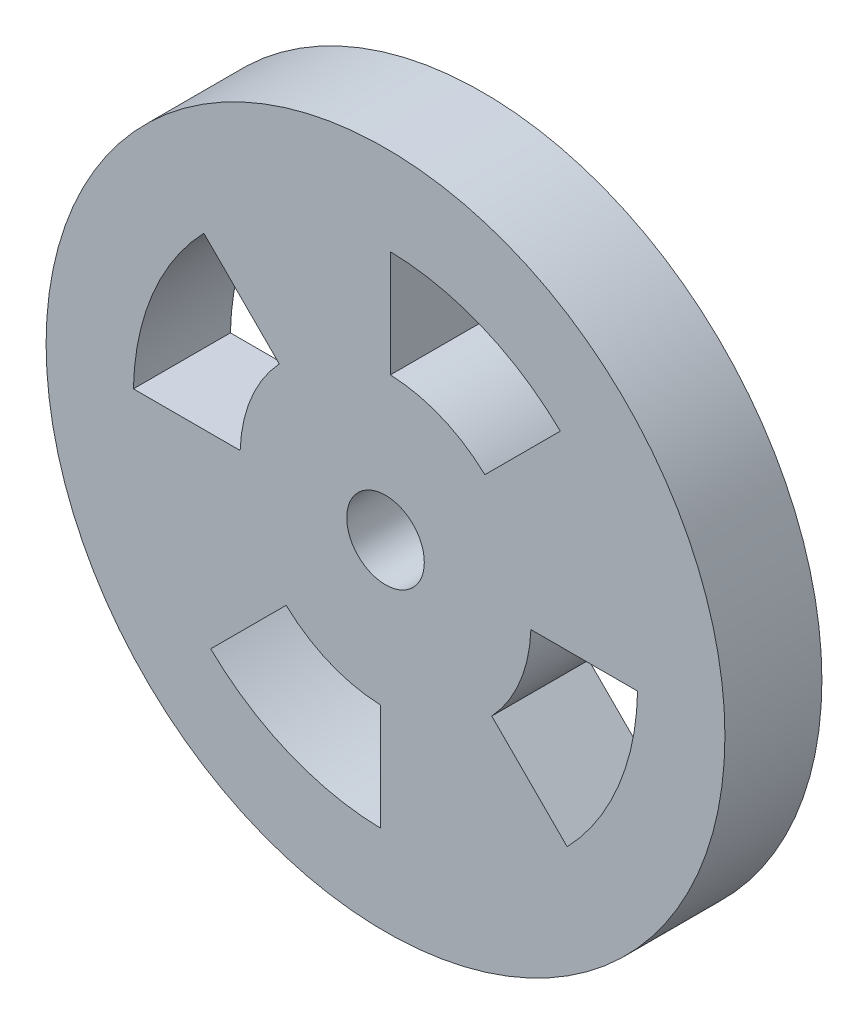
ISO-10303-21;
HEADER;
FILE_DESCRIPTION(('STEP AP214'),'2;1');
FILE_NAME('part.step','',(''),(''),'','','');
FILE_SCHEMA(('AUTOMOTIVE_DESIGN { 1 0 10303 214 1 1 1 1 }'));
ENDSEC;
DATA;
#1=APPLICATION_CONTEXT('core data for automotive mechanical design processes');
#2=APPLICATION_PROTOCOL_DEFINITION('international standard','automotive_design',2000,#1);
#3=PRODUCT_CONTEXT('',#1,'mechanical');
#4=PRODUCT('Part','Part','',(#3));
#5=PRODUCT_RELATED_PRODUCT_CATEGORY('part','',(#4));
#6=PRODUCT_DEFINITION_FORMATION('','',#4);
#7=PRODUCT_DEFINITION_CONTEXT('part definition',#1,'design');
#8=PRODUCT_DEFINITION('design','',#6,#7);
#9=PRODUCT_DEFINITION_SHAPE('','',#8);
#10=(LENGTH_UNIT() NAMED_UNIT(*) SI_UNIT(.MILLI.,.METRE.));
#11=(NAMED_UNIT(*) PLANE_ANGLE_UNIT() SI_UNIT($,.RADIAN.));
#12=(NAMED_UNIT(*) SI_UNIT($,.STERADIAN.) SOLID_ANGLE_UNIT());
#13=UNCERTAINTY_MEASURE_WITH_UNIT(LENGTH_MEASURE(1.E-05),#10,'distance_accuracy_value','');
#14=(GEOMETRIC_REPRESENTATION_CONTEXT(3) GLOBAL_UNCERTAINTY_ASSIGNED_CONTEXT((#13)) GLOBAL_UNIT_ASSIGNED_CONTEXT((#10,
#11,#12)) REPRESENTATION_CONTEXT('',''));
#15=CARTESIAN_POINT('',(0.,0.,0.));
#16=DIRECTION('',(0.,0.,1.));
#17=DIRECTION('',(1.,0.,0.));
#18=AXIS2_PLACEMENT_3D('',#15,#16,#17);
#19=CARTESIAN_POINT('',(0.,0.,1.));
#20=DIRECTION('',(0.,0.,1.));
#21=DIRECTION('',(1.,0.,0.));
#22=AXIS2_PLACEMENT_3D('',#19,#20,#21);
#23=PLANE('',#22);
#24=DIRECTION('',(-0.707106781186548,-0.707106781186548,0.));
#25=VECTOR('',#24,1.);
#26=CARTESIAN_POINT('',(-0.035355339160987,0.035355339160987,1.));
#27=LINE('',#26,#25);
#28=CARTESIAN_POINT('',(1.80278230530224,1.87349298362421,1.));
#29=VERTEX_POINT('',#28);
#30=CARTESIAN_POINT('',(1.02471541319133,1.09542609151331,1.));
#31=VERTEX_POINT('',#30);
#32=EDGE_CURVE('E184',#29,#31,#27,.T.);
#33=ORIENTED_EDGE('',*,*,#32,.T.);
#34=CARTESIAN_POINT('',(0.,0.,1.));
#35=DIRECTION('',(0.,0.,1.));
#36=DIRECTION('',(1.,0.,0.));
#37=AXIS2_PLACEMENT_3D('',#34,#35,#36);
#38=CIRCLE('',#37,1.5);
#39=CARTESIAN_POINT('',(0.0499999999999945,1.4991664350565,1.));
#40=VERTEX_POINT('',#39);
#41=EDGE_CURVE('E161',#31,#40,#38,.T.);
#42=ORIENTED_EDGE('',*,*,#41,.T.);
#43=DIRECTION('',(0.,-1.,0.));
#44=VECTOR('',#43,1.);
#45=CARTESIAN_POINT('',(0.0499999999999945,0.,1.));
#46=LINE('',#45,#44);
#47=CARTESIAN_POINT('',(0.0499999999999943,2.59951918631119,1.));
#48=VERTEX_POINT('',#47);
#49=EDGE_CURVE('E195',#48,#40,#46,.T.);
#50=ORIENTED_EDGE('',*,*,#49,.F.);
#51=CARTESIAN_POINT('',(0.,0.,1.));
#52=DIRECTION('',(0.,0.,1.));
#53=DIRECTION('',(1.,0.,0.));
#54=AXIS2_PLACEMENT_3D('',#51,#52,#53);
#55=CIRCLE('',#54,2.6);
#56=EDGE_CURVE('E198',#29,#48,#55,.T.);
#57=ORIENTED_EDGE('',*,*,#56,.F.);
#58=EDGE_LOOP('',(#33,#42,#50,#57));
#59=FACE_BOUND('',#58,.T.);
#60=DIRECTION('',(0.707106781186548,0.707106781186548,0.));
#61=VECTOR('',#60,1.);
#62=CARTESIAN_POINT('',(0.035355339160987,-0.035355339160987,1.));
#63=LINE('',#62,#61);
#64=CARTESIAN_POINT('',(-1.80278230530224,-1.87349298362421,1.));
#65=VERTEX_POINT('',#64);
#66=CARTESIAN_POINT('',(-1.02471541319133,-1.09542609151331,1.));
#67=VERTEX_POINT('',#66);
#68=EDGE_CURVE('E246',#65,#67,#63,.T.);
#69=ORIENTED_EDGE('',*,*,#68,.T.);
#70=CARTESIAN_POINT('',(0.,0.,1.));
#71=DIRECTION('',(0.,0.,1.));
#72=DIRECTION('',(1.,0.,0.));
#73=AXIS2_PLACEMENT_3D('',#70,#71,#72);
#74=CIRCLE('',#73,1.5);
#75=CARTESIAN_POINT('',(-0.0499999999999945,-1.4991664350565,1.));
#76=VERTEX_POINT('',#75);
#77=EDGE_CURVE('E242',#67,#76,#74,.T.);
#78=ORIENTED_EDGE('',*,*,#77,.T.);
#79=DIRECTION('',(0.,1.,0.));
#80=VECTOR('',#79,1.);
#81=CARTESIAN_POINT('',(-0.0499999999999945,0.,1.));
#82=LINE('',#81,#80);
#83=CARTESIAN_POINT('',(-0.0499999999999958,-2.59951918631119,1.));
#84=VERTEX_POINT('',#83);
#85=EDGE_CURVE('E257',#84,#76,#82,.T.);
#86=ORIENTED_EDGE('',*,*,#85,.F.);
#87=CARTESIAN_POINT('',(0.,0.,1.));
#88=DIRECTION('',(0.,0.,1.));
#89=DIRECTION('',(1.,0.,0.));
#90=AXIS2_PLACEMENT_3D('',#87,#88,#89);
#91=CIRCLE('',#90,2.6);
#92=EDGE_CURVE('E260',#65,#84,#91,.T.);
#93=ORIENTED_EDGE('',*,*,#92,.F.);
#94=EDGE_LOOP('',(#69,#78,#86,#93));
#95=FACE_BOUND('',#94,.T.);
#96=CARTESIAN_POINT('',(0.,0.,1.));
#97=DIRECTION('',(0.,0.,1.));
#98=DIRECTION('',(1.,0.,0.));
#99=AXIS2_PLACEMENT_3D('',#96,#97,#98);
#100=CIRCLE('',#99,0.4);
#101=CARTESIAN_POINT('',(0.4,0.,1.));
#102=VERTEX_POINT('',#101);
#103=EDGE_CURVE('E273',#102,#102,#100,.T.);
#104=ORIENTED_EDGE('',*,*,#103,.F.);
#105=EDGE_LOOP('',(#104));
#106=FACE_BOUND('',#105,.T.);
#107=CARTESIAN_POINT('',(0.,0.,1.));
#108=DIRECTION('',(0.,0.,1.));
#109=DIRECTION('',(1.,0.,0.));
#110=AXIS2_PLACEMENT_3D('',#107,#108,#109);
#111=CIRCLE('',#110,3.5);
#112=CARTESIAN_POINT('',(3.5,0.,1.));
#113=VERTEX_POINT('',#112);
#114=EDGE_CURVE('E11',#113,#113,#111,.T.);
#115=ORIENTED_EDGE('',*,*,#114,.T.);
#116=EDGE_LOOP('',(#115));
#117=FACE_BOUND('',#116,.T.);
#118=DIRECTION('',(-0.70710678118655,0.707106781186545,0.));
#119=VECTOR('',#118,1.);
#120=CARTESIAN_POINT('',(0.0353553391609868,0.0353553391609871,1.));
#121=LINE('',#120,#119);
#122=CARTESIAN_POINT('',(1.87349298362422,-1.80278230530223,1.));
#123=VERTEX_POINT('',#122);
#124=CARTESIAN_POINT('',(1.09542609151331,-1.02471541319133,1.));
#125=VERTEX_POINT('',#124);
#126=EDGE_CURVE('E215',#123,#125,#121,.T.);
#127=ORIENTED_EDGE('',*,*,#126,.T.);
#128=CARTESIAN_POINT('',(0.,0.,1.));
#129=DIRECTION('',(0.,0.,1.));
#130=DIRECTION('',(1.,0.,0.));
#131=AXIS2_PLACEMENT_3D('',#128,#129,#130);
#132=CIRCLE('',#131,1.5);
#133=CARTESIAN_POINT('',(1.4991664350565,-0.0499999999999893,1.));
#134=VERTEX_POINT('',#133);
#135=EDGE_CURVE('E211',#125,#134,#132,.T.);
#136=ORIENTED_EDGE('',*,*,#135,.T.);
#137=DIRECTION('',(-1.,0.,0.));
#138=VECTOR('',#137,1.);
#139=CARTESIAN_POINT('',(0.,-0.0499999999999945,1.));
#140=LINE('',#139,#138);
#141=CARTESIAN_POINT('',(2.59951918631119,-0.0499999999999867,1.));
#142=VERTEX_POINT('',#141);
#143=EDGE_CURVE('E226',#142,#134,#140,.T.);
#144=ORIENTED_EDGE('',*,*,#143,.F.);
#145=CARTESIAN_POINT('',(0.,0.,1.));
#146=DIRECTION('',(0.,0.,1.));
#147=DIRECTION('',(1.,0.,0.));
#148=AXIS2_PLACEMENT_3D('',#145,#146,#147);
#149=CIRCLE('',#148,2.6);
#150=EDGE_CURVE('E229',#123,#142,#149,.T.);
#151=ORIENTED_EDGE('',*,*,#150,.F.);
#152=EDGE_LOOP('',(#127,#136,#144,#151));
#153=FACE_BOUND('',#152,.T.);
#154=DIRECTION('',(0.707106781186555,-0.70710678118654,0.));
#155=VECTOR('',#154,1.);
#156=CARTESIAN_POINT('',(-0.0353553391408894,-0.0353553391408902,1.));
#157=LINE('',#156,#155);
#158=CARTESIAN_POINT('',(-1.87349298360451,1.80278230532269,1.));
#159=VERTEX_POINT('',#158);
#160=CARTESIAN_POINT('',(-1.09542609149391,1.02471541321211,1.));
#161=VERTEX_POINT('',#160);
#162=EDGE_CURVE('E154',#159,#161,#157,.T.);
#163=ORIENTED_EDGE('',*,*,#162,.T.);
#164=CARTESIAN_POINT('',(0.,0.,1.));
#165=DIRECTION('',(0.,0.,1.));
#166=DIRECTION('',(1.,0.,0.));
#167=AXIS2_PLACEMENT_3D('',#164,#165,#166);
#168=CIRCLE('',#167,1.5);
#169=CARTESIAN_POINT('',(-1.4991664350565,0.0499999999999788,1.));
#170=VERTEX_POINT('',#169);
#171=EDGE_CURVE('E47',#161,#170,#168,.T.);
#172=ORIENTED_EDGE('',*,*,#171,.T.);
#173=DIRECTION('',(1.,0.,0.));
#174=VECTOR('',#173,1.);
#175=CARTESIAN_POINT('',(0.,0.0499999999999945,1.));
#176=LINE('',#175,#174);
#177=CARTESIAN_POINT('',(-2.59951918631119,0.0499999999999668,1.));
#178=VERTEX_POINT('',#177);
#179=EDGE_CURVE('E160',#178,#170,#176,.T.);
#180=ORIENTED_EDGE('',*,*,#179,.F.);
#181=CARTESIAN_POINT('',(0.,0.,1.));
#182=DIRECTION('',(0.,0.,1.));
#183=DIRECTION('',(1.,0.,0.));
#184=AXIS2_PLACEMENT_3D('',#181,#182,#183);
#185=CIRCLE('',#184,2.6);
#186=EDGE_CURVE('E172',#159,#178,#185,.T.);
#187=ORIENTED_EDGE('',*,*,#186,.F.);
#188=EDGE_LOOP('',(#163,#172,#180,#187));
#189=FACE_BOUND('',#188,.T.);
#190=ADVANCED_FACE('F32',(#59,#95,#106,#117,#153,#189),#23,.T.);
#191=CARTESIAN_POINT('',(0.,0.,0.));
#192=DIRECTION('',(0.,0.,1.));
#193=DIRECTION('',(1.,0.,0.));
#194=AXIS2_PLACEMENT_3D('',#191,#192,#193);
#195=PLANE('',#194);
#196=CARTESIAN_POINT('',(0.,0.,0.));
#197=DIRECTION('',(0.,0.,1.));
#198=DIRECTION('',(1.,0.,0.));
#199=AXIS2_PLACEMENT_3D('',#196,#197,#198);
#200=CIRCLE('',#199,1.5);
#201=CARTESIAN_POINT('',(1.02471541319133,1.09542609151331,0.));
#202=VERTEX_POINT('',#201);
#203=CARTESIAN_POINT('',(0.0499999999999945,1.4991664350565,0.));
#204=VERTEX_POINT('',#203);
#205=EDGE_CURVE('E181',#202,#204,#200,.T.);
#206=ORIENTED_EDGE('',*,*,#205,.F.);
#207=DIRECTION('',(-0.707106781186548,-0.707106781186548,0.));
#208=VECTOR('',#207,1.);
#209=CARTESIAN_POINT('',(-0.035355339160987,0.035355339160987,0.));
#210=LINE('',#209,#208);
#211=CARTESIAN_POINT('',(1.80278230530224,1.87349298362421,0.));
#212=VERTEX_POINT('',#211);
#213=EDGE_CURVE('E190',#212,#202,#210,.T.);
#214=ORIENTED_EDGE('',*,*,#213,.F.);
#215=CARTESIAN_POINT('',(0.,0.,0.));
#216=DIRECTION('',(0.,0.,1.));
#217=DIRECTION('',(1.,0.,0.));
#218=AXIS2_PLACEMENT_3D('',#215,#216,#217);
#219=CIRCLE('',#218,2.6);
#220=CARTESIAN_POINT('',(0.0499999999999943,2.59951918631119,0.));
#221=VERTEX_POINT('',#220);
#222=EDGE_CURVE('E187',#212,#221,#219,.T.);
#223=ORIENTED_EDGE('',*,*,#222,.T.);
#224=DIRECTION('',(0.,-1.,0.));
#225=VECTOR('',#224,1.);
#226=CARTESIAN_POINT('',(0.0499999999999945,0.,0.));
#227=LINE('',#226,#225);
#228=EDGE_CURVE('E183',#221,#204,#227,.T.);
#229=ORIENTED_EDGE('',*,*,#228,.T.);
#230=EDGE_LOOP('',(#206,#214,#223,#229));
#231=FACE_BOUND('',#230,.T.);
#232=CARTESIAN_POINT('',(0.,0.,0.));
#233=DIRECTION('',(0.,0.,1.));
#234=DIRECTION('',(1.,0.,0.));
#235=AXIS2_PLACEMENT_3D('',#232,#233,#234);
#236=CIRCLE('',#235,1.5);
#237=CARTESIAN_POINT('',(-1.02471541319133,-1.09542609151331,0.));
#238=VERTEX_POINT('',#237);
#239=CARTESIAN_POINT('',(-0.0499999999999945,-1.4991664350565,0.));
#240=VERTEX_POINT('',#239);
#241=EDGE_CURVE('E243',#238,#240,#236,.T.);
#242=ORIENTED_EDGE('',*,*,#241,.F.);
#243=DIRECTION('',(0.707106781186548,0.707106781186548,0.));
#244=VECTOR('',#243,1.);
#245=CARTESIAN_POINT('',(0.035355339160987,-0.035355339160987,0.));
#246=LINE('',#245,#244);
#247=CARTESIAN_POINT('',(-1.80278230530224,-1.87349298362421,0.));
#248=VERTEX_POINT('',#247);
#249=EDGE_CURVE('E252',#248,#238,#246,.T.);
#250=ORIENTED_EDGE('',*,*,#249,.F.);
#251=CARTESIAN_POINT('',(0.,0.,0.));
#252=DIRECTION('',(0.,0.,1.));
#253=DIRECTION('',(1.,0.,0.));
#254=AXIS2_PLACEMENT_3D('',#251,#252,#253);
#255=CIRCLE('',#254,2.6);
#256=CARTESIAN_POINT('',(-0.0499999999999958,-2.59951918631119,0.));
#257=VERTEX_POINT('',#256);
#258=EDGE_CURVE('E249',#248,#257,#255,.T.);
#259=ORIENTED_EDGE('',*,*,#258,.T.);
#260=DIRECTION('',(0.,1.,0.));
#261=VECTOR('',#260,1.);
#262=CARTESIAN_POINT('',(-0.0499999999999945,0.,0.));
#263=LINE('',#262,#261);
#264=EDGE_CURVE('E245',#257,#240,#263,.T.);
#265=ORIENTED_EDGE('',*,*,#264,.T.);
#266=EDGE_LOOP('',(#242,#250,#259,#265));
#267=FACE_BOUND('',#266,.T.);
#268=CARTESIAN_POINT('',(0.,0.,0.));
#269=DIRECTION('',(0.,0.,1.));
#270=DIRECTION('',(1.,0.,0.));
#271=AXIS2_PLACEMENT_3D('',#268,#269,#270);
#272=CIRCLE('',#271,0.4);
#273=CARTESIAN_POINT('',(0.4,0.,0.));
#274=VERTEX_POINT('',#273);
#275=EDGE_CURVE('E274',#274,#274,#272,.T.);
#276=ORIENTED_EDGE('',*,*,#275,.T.);
#277=EDGE_LOOP('',(#276));
#278=FACE_BOUND('',#277,.T.);
#279=CARTESIAN_POINT('',(0.,0.,0.));
#280=DIRECTION('',(0.,0.,1.));
#281=DIRECTION('',(1.,0.,0.));
#282=AXIS2_PLACEMENT_3D('',#279,#280,#281);
#283=CIRCLE('',#282,3.5);
#284=CARTESIAN_POINT('',(3.5,0.,0.));
#285=VERTEX_POINT('',#284);
#286=EDGE_CURVE('E36',#285,#285,#283,.T.);
#287=ORIENTED_EDGE('',*,*,#286,.F.);
#288=EDGE_LOOP('',(#287));
#289=FACE_BOUND('',#288,.T.);
#290=CARTESIAN_POINT('',(0.,0.,0.));
#291=DIRECTION('',(0.,0.,1.));
#292=DIRECTION('',(1.,0.,0.));
#293=AXIS2_PLACEMENT_3D('',#290,#291,#292);
#294=CIRCLE('',#293,1.5);
#295=CARTESIAN_POINT('',(1.09542609151331,-1.02471541319133,0.));
#296=VERTEX_POINT('',#295);
#297=CARTESIAN_POINT('',(1.4991664350565,-0.0499999999999893,0.));
#298=VERTEX_POINT('',#297);
#299=EDGE_CURVE('E212',#296,#298,#294,.T.);
#300=ORIENTED_EDGE('',*,*,#299,.F.);
#301=DIRECTION('',(-0.70710678118655,0.707106781186545,0.));
#302=VECTOR('',#301,1.);
#303=CARTESIAN_POINT('',(0.0353553391609868,0.0353553391609871,0.));
#304=LINE('',#303,#302);
#305=CARTESIAN_POINT('',(1.87349298362422,-1.80278230530223,0.));
#306=VERTEX_POINT('',#305);
#307=EDGE_CURVE('E221',#306,#296,#304,.T.);
#308=ORIENTED_EDGE('',*,*,#307,.F.);
#309=CARTESIAN_POINT('',(0.,0.,0.));
#310=DIRECTION('',(0.,0.,1.));
#311=DIRECTION('',(1.,0.,0.));
#312=AXIS2_PLACEMENT_3D('',#309,#310,#311);
#313=CIRCLE('',#312,2.6);
#314=CARTESIAN_POINT('',(2.59951918631119,-0.0499999999999867,0.));
#315=VERTEX_POINT('',#314);
#316=EDGE_CURVE('E218',#306,#315,#313,.T.);
#317=ORIENTED_EDGE('',*,*,#316,.T.);
#318=DIRECTION('',(-1.,0.,0.));
#319=VECTOR('',#318,1.);
#320=CARTESIAN_POINT('',(0.,-0.0499999999999945,0.));
#321=LINE('',#320,#319);
#322=EDGE_CURVE('E214',#315,#298,#321,.T.);
#323=ORIENTED_EDGE('',*,*,#322,.T.);
#324=EDGE_LOOP('',(#300,#308,#317,#323));
#325=FACE_BOUND('',#324,.T.);
#326=CARTESIAN_POINT('',(0.,0.,0.));
#327=DIRECTION('',(0.,0.,1.));
#328=DIRECTION('',(1.,0.,0.));
#329=AXIS2_PLACEMENT_3D('',#326,#327,#328);
#330=CIRCLE('',#329,1.5);
#331=CARTESIAN_POINT('',(-1.09542609149391,1.02471541321211,0.));
#332=VERTEX_POINT('',#331);
#333=CARTESIAN_POINT('',(-1.4991664350565,0.0499999999999788,0.));
#334=VERTEX_POINT('',#333);
#335=EDGE_CURVE('E144',#332,#334,#330,.T.);
#336=ORIENTED_EDGE('',*,*,#335,.F.);
#337=DIRECTION('',(0.707106781186555,-0.70710678118654,0.));
#338=VECTOR('',#337,1.);
#339=CARTESIAN_POINT('',(-0.0353553391408894,-0.0353553391408902,0.));
#340=LINE('',#339,#338);
#341=CARTESIAN_POINT('',(-1.87349298360451,1.80278230532269,0.));
#342=VERTEX_POINT('',#341);
#343=EDGE_CURVE('E166',#342,#332,#340,.T.);
#344=ORIENTED_EDGE('',*,*,#343,.F.);
#345=CARTESIAN_POINT('',(0.,0.,0.));
#346=DIRECTION('',(0.,0.,1.));
#347=DIRECTION('',(1.,0.,0.));
#348=AXIS2_PLACEMENT_3D('',#345,#346,#347);
#349=CIRCLE('',#348,2.6);
#350=CARTESIAN_POINT('',(-2.59951918631119,0.0499999999999668,0.));
#351=VERTEX_POINT('',#350);
#352=EDGE_CURVE('E55',#342,#351,#349,.T.);
#353=ORIENTED_EDGE('',*,*,#352,.T.);
#354=DIRECTION('',(1.,0.,0.));
#355=VECTOR('',#354,1.);
#356=CARTESIAN_POINT('',(0.,0.0499999999999945,0.));
#357=LINE('',#356,#355);
#358=EDGE_CURVE('E153',#351,#334,#357,.T.);
#359=ORIENTED_EDGE('',*,*,#358,.T.);
#360=EDGE_LOOP('',(#336,#344,#353,#359));
#361=FACE_BOUND('',#360,.T.);
#362=ADVANCED_FACE('F164',(#231,#267,#278,#289,#325,#361),#195,.F.);
#363=CARTESIAN_POINT('',(0.,0.,1.));
#364=DIRECTION('',(0.,0.,-1.));
#365=DIRECTION('',(-1.,0.,0.));
#366=AXIS2_PLACEMENT_3D('',#363,#364,#365);
#367=CYLINDRICAL_SURFACE('',#366,3.5);
#368=ORIENTED_EDGE('',*,*,#114,.F.);
#369=EDGE_LOOP('',(#368));
#370=FACE_BOUND('',#369,.T.);
#371=ORIENTED_EDGE('',*,*,#286,.T.);
#372=EDGE_LOOP('',(#371));
#373=FACE_BOUND('',#372,.T.);
#374=ADVANCED_FACE('F34',(#370,#373),#367,.T.);
#375=CARTESIAN_POINT('',(0.,0.,0.));
#376=DIRECTION('',(0.,0.,1.));
#377=DIRECTION('',(1.,0.,0.));
#378=AXIS2_PLACEMENT_3D('',#375,#376,#377);
#379=CYLINDRICAL_SURFACE('',#378,0.4);
#380=ORIENTED_EDGE('',*,*,#275,.F.);
#381=EDGE_LOOP('',(#380));
#382=FACE_BOUND('',#381,.T.);
#383=ORIENTED_EDGE('',*,*,#103,.T.);
#384=EDGE_LOOP('',(#383));
#385=FACE_BOUND('',#384,.T.);
#386=ADVANCED_FACE('F280',(#382,#385),#379,.F.);
#387=CARTESIAN_POINT('',(0.,0.,0.));
#388=DIRECTION('',(0.,0.,1.));
#389=DIRECTION('',(1.,0.,0.));
#390=AXIS2_PLACEMENT_3D('',#387,#388,#389);
#391=CYLINDRICAL_SURFACE('',#390,1.5);
#392=ORIENTED_EDGE('',*,*,#77,.F.);
#393=DIRECTION('',(0.,0.,1.));
#394=VECTOR('',#393,1.);
#395=CARTESIAN_POINT('',(-1.02471541319133,-1.09542609151331,0.));
#396=LINE('',#395,#394);
#397=EDGE_CURVE('E254',#238,#67,#396,.T.);
#398=ORIENTED_EDGE('',*,*,#397,.F.);
#399=ORIENTED_EDGE('',*,*,#241,.T.);
#400=DIRECTION('',(0.,0.,1.));
#401=VECTOR('',#400,1.);
#402=CARTESIAN_POINT('',(-0.0499999999999945,-1.4991664350565,0.));
#403=LINE('',#402,#401);
#404=EDGE_CURVE('E271',#240,#76,#403,.T.);
#405=ORIENTED_EDGE('',*,*,#404,.T.);
#406=EDGE_LOOP('',(#392,#398,#399,#405));
#407=FACE_BOUND('',#406,.T.);
#408=ADVANCED_FACE('F350',(#407),#391,.T.);
#409=CARTESIAN_POINT('',(-0.0499999999999945,0.,0.));
#410=DIRECTION('',(1.,0.,0.));
#411=DIRECTION('',(0.,0.,-1.));
#412=AXIS2_PLACEMENT_3D('',#409,#410,#411);
#413=PLANE('',#412);
#414=ORIENTED_EDGE('',*,*,#85,.T.);
#415=ORIENTED_EDGE('',*,*,#404,.F.);
#416=ORIENTED_EDGE('',*,*,#264,.F.);
#417=DIRECTION('',(0.,0.,1.));
#418=VECTOR('',#417,1.);
#419=CARTESIAN_POINT('',(-0.0499999999999958,-2.59951918631119,0.));
#420=LINE('',#419,#418);
#421=EDGE_CURVE('E269',#257,#84,#420,.T.);
#422=ORIENTED_EDGE('',*,*,#421,.T.);
#423=EDGE_LOOP('',(#414,#415,#416,#422));
#424=FACE_BOUND('',#423,.T.);
#425=ADVANCED_FACE('F346',(#424),#413,.F.);
#426=CARTESIAN_POINT('',(0.,0.,0.));
#427=DIRECTION('',(0.,0.,1.));
#428=DIRECTION('',(1.,0.,0.));
#429=AXIS2_PLACEMENT_3D('',#426,#427,#428);
#430=CYLINDRICAL_SURFACE('',#429,2.6);
#431=ORIENTED_EDGE('',*,*,#92,.T.);
#432=ORIENTED_EDGE('',*,*,#421,.F.);
#433=ORIENTED_EDGE('',*,*,#258,.F.);
#434=DIRECTION('',(0.,0.,1.));
#435=VECTOR('',#434,1.);
#436=CARTESIAN_POINT('',(-1.80278230530224,-1.87349298362421,0.));
#437=LINE('',#436,#435);
#438=EDGE_CURVE('E267',#248,#65,#437,.T.);
#439=ORIENTED_EDGE('',*,*,#438,.T.);
#440=EDGE_LOOP('',(#431,#432,#433,#439));
#441=FACE_BOUND('',#440,.T.);
#442=ADVANCED_FACE('F342',(#441),#430,.F.);
#443=CARTESIAN_POINT('',(0.035355339160987,-0.035355339160987,0.));
#444=DIRECTION('',(0.707106781186547,-0.707106781186547,0.));
#445=DIRECTION('',(0.707106781186548,0.707106781186548,0.));
#446=AXIS2_PLACEMENT_3D('',#443,#444,#445);
#447=PLANE('',#446);
#448=ORIENTED_EDGE('',*,*,#68,.F.);
#449=ORIENTED_EDGE('',*,*,#438,.F.);
#450=ORIENTED_EDGE('',*,*,#249,.T.);
#451=ORIENTED_EDGE('',*,*,#397,.T.);
#452=EDGE_LOOP('',(#448,#449,#450,#451));
#453=FACE_BOUND('',#452,.T.);
#454=ADVANCED_FACE('F338',(#453),#447,.T.);
#455=CARTESIAN_POINT('',(0.,0.,0.));
#456=DIRECTION('',(0.,0.,1.));
#457=DIRECTION('',(1.,0.,0.));
#458=AXIS2_PLACEMENT_3D('',#455,#456,#457);
#459=CYLINDRICAL_SURFACE('',#458,1.5);
#460=ORIENTED_EDGE('',*,*,#135,.F.);
#461=DIRECTION('',(0.,0.,1.));
#462=VECTOR('',#461,1.);
#463=CARTESIAN_POINT('',(1.09542609151331,-1.02471541319133,0.));
#464=LINE('',#463,#462);
#465=EDGE_CURVE('E223',#296,#125,#464,.T.);
#466=ORIENTED_EDGE('',*,*,#465,.F.);
#467=ORIENTED_EDGE('',*,*,#299,.T.);
#468=DIRECTION('',(0.,0.,1.));
#469=VECTOR('',#468,1.);
#470=CARTESIAN_POINT('',(1.4991664350565,-0.0499999999999893,0.));
#471=LINE('',#470,#469);
#472=EDGE_CURVE('E240',#298,#134,#471,.T.);
#473=ORIENTED_EDGE('',*,*,#472,.T.);
#474=EDGE_LOOP('',(#460,#466,#467,#473));
#475=FACE_BOUND('',#474,.T.);
#476=ADVANCED_FACE('F334',(#475),#459,.T.);
#477=CARTESIAN_POINT('',(0.,-0.0499999999999945,0.));
#478=DIRECTION('',(0.,1.,0.));
#479=DIRECTION('',(-1.,0.,0.));
#480=AXIS2_PLACEMENT_3D('',#477,#478,#479);
#481=PLANE('',#480);
#482=ORIENTED_EDGE('',*,*,#143,.T.);
#483=ORIENTED_EDGE('',*,*,#472,.F.);
#484=ORIENTED_EDGE('',*,*,#322,.F.);
#485=DIRECTION('',(0.,0.,1.));
#486=VECTOR('',#485,1.);
#487=CARTESIAN_POINT('',(2.59951918631119,-0.0499999999999867,0.));
#488=LINE('',#487,#486);
#489=EDGE_CURVE('E238',#315,#142,#488,.T.);
#490=ORIENTED_EDGE('',*,*,#489,.T.);
#491=EDGE_LOOP('',(#482,#483,#484,#490));
#492=FACE_BOUND('',#491,.T.);
#493=ADVANCED_FACE('F330',(#492),#481,.F.);
#494=CARTESIAN_POINT('',(0.,0.,0.));
#495=DIRECTION('',(0.,0.,1.));
#496=DIRECTION('',(1.,0.,0.));
#497=AXIS2_PLACEMENT_3D('',#494,#495,#496);
#498=CYLINDRICAL_SURFACE('',#497,2.6);
#499=ORIENTED_EDGE('',*,*,#150,.T.);
#500=ORIENTED_EDGE('',*,*,#489,.F.);
#501=ORIENTED_EDGE('',*,*,#316,.F.);
#502=DIRECTION('',(0.,0.,1.));
#503=VECTOR('',#502,1.);
#504=CARTESIAN_POINT('',(1.87349298362422,-1.80278230530223,0.));
#505=LINE('',#504,#503);
#506=EDGE_CURVE('E236',#306,#123,#505,.T.);
#507=ORIENTED_EDGE('',*,*,#506,.T.);
#508=EDGE_LOOP('',(#499,#500,#501,#507));
#509=FACE_BOUND('',#508,.T.);
#510=ADVANCED_FACE('F326',(#509),#498,.F.);
#511=CARTESIAN_POINT('',(0.0353553391609868,0.0353553391609871,0.));
#512=DIRECTION('',(0.707106781186545,0.70710678118655,0.));
#513=DIRECTION('',(-0.70710678118655,0.707106781186545,0.));
#514=AXIS2_PLACEMENT_3D('',#511,#512,#513);
#515=PLANE('',#514);
#516=ORIENTED_EDGE('',*,*,#126,.F.);
#517=ORIENTED_EDGE('',*,*,#506,.F.);
#518=ORIENTED_EDGE('',*,*,#307,.T.);
#519=ORIENTED_EDGE('',*,*,#465,.T.);
#520=EDGE_LOOP('',(#516,#517,#518,#519));
#521=FACE_BOUND('',#520,.T.);
#522=ADVANCED_FACE('F322',(#521),#515,.T.);
#523=CARTESIAN_POINT('',(0.,0.,0.));
#524=DIRECTION('',(0.,0.,1.));
#525=DIRECTION('',(1.,0.,0.));
#526=AXIS2_PLACEMENT_3D('',#523,#524,#525);
#527=CYLINDRICAL_SURFACE('',#526,1.5);
#528=ORIENTED_EDGE('',*,*,#41,.F.);
#529=DIRECTION('',(0.,0.,1.));
#530=VECTOR('',#529,1.);
#531=CARTESIAN_POINT('',(1.02471541319133,1.09542609151331,0.));
#532=LINE('',#531,#530);
#533=EDGE_CURVE('E192',#202,#31,#532,.T.);
#534=ORIENTED_EDGE('',*,*,#533,.F.);
#535=ORIENTED_EDGE('',*,*,#205,.T.);
#536=DIRECTION('',(0.,0.,1.));
#537=VECTOR('',#536,1.);
#538=CARTESIAN_POINT('',(0.0499999999999945,1.4991664350565,0.));
#539=LINE('',#538,#537);
#540=EDGE_CURVE('E209',#204,#40,#539,.T.);
#541=ORIENTED_EDGE('',*,*,#540,.T.);
#542=EDGE_LOOP('',(#528,#534,#535,#541));
#543=FACE_BOUND('',#542,.T.);
#544=ADVANCED_FACE('F318',(#543),#527,.T.);
#545=CARTESIAN_POINT('',(0.0499999999999945,0.,0.));
#546=DIRECTION('',(-1.,0.,0.));
#547=DIRECTION('',(0.,0.,1.));
#548=AXIS2_PLACEMENT_3D('',#545,#546,#547);
#549=PLANE('',#548);
#550=ORIENTED_EDGE('',*,*,#49,.T.);
#551=ORIENTED_EDGE('',*,*,#540,.F.);
#552=ORIENTED_EDGE('',*,*,#228,.F.);
#553=DIRECTION('',(0.,0.,1.));
#554=VECTOR('',#553,1.);
#555=CARTESIAN_POINT('',(0.0499999999999943,2.59951918631119,0.));
#556=LINE('',#555,#554);
#557=EDGE_CURVE('E207',#221,#48,#556,.T.);
#558=ORIENTED_EDGE('',*,*,#557,.T.);
#559=EDGE_LOOP('',(#550,#551,#552,#558));
#560=FACE_BOUND('',#559,.T.);
#561=ADVANCED_FACE('F314',(#560),#549,.F.);
#562=CARTESIAN_POINT('',(0.,0.,0.));
#563=DIRECTION('',(0.,0.,1.));
#564=DIRECTION('',(1.,0.,0.));
#565=AXIS2_PLACEMENT_3D('',#562,#563,#564);
#566=CYLINDRICAL_SURFACE('',#565,2.6);
#567=ORIENTED_EDGE('',*,*,#56,.T.);
#568=ORIENTED_EDGE('',*,*,#557,.F.);
#569=ORIENTED_EDGE('',*,*,#222,.F.);
#570=DIRECTION('',(0.,0.,1.));
#571=VECTOR('',#570,1.);
#572=CARTESIAN_POINT('',(1.80278230530224,1.87349298362421,0.));
#573=LINE('',#572,#571);
#574=EDGE_CURVE('E205',#212,#29,#573,.T.);
#575=ORIENTED_EDGE('',*,*,#574,.T.);
#576=EDGE_LOOP('',(#567,#568,#569,#575));
#577=FACE_BOUND('',#576,.T.);
#578=ADVANCED_FACE('F310',(#577),#566,.F.);
#579=CARTESIAN_POINT('',(-0.035355339160987,0.035355339160987,0.));
#580=DIRECTION('',(-0.707106781186547,0.707106781186547,0.));
#581=DIRECTION('',(-0.707106781186548,-0.707106781186548,0.));
#582=AXIS2_PLACEMENT_3D('',#579,#580,#581);
#583=PLANE('',#582);
#584=ORIENTED_EDGE('',*,*,#32,.F.);
#585=ORIENTED_EDGE('',*,*,#574,.F.);
#586=ORIENTED_EDGE('',*,*,#213,.T.);
#587=ORIENTED_EDGE('',*,*,#533,.T.);
#588=EDGE_LOOP('',(#584,#585,#586,#587));
#589=FACE_BOUND('',#588,.T.);
#590=ADVANCED_FACE('F307',(#589),#583,.T.);
#591=CARTESIAN_POINT('',(0.,0.,0.));
#592=DIRECTION('',(0.,0.,1.));
#593=DIRECTION('',(1.,0.,0.));
#594=AXIS2_PLACEMENT_3D('',#591,#592,#593);
#595=CYLINDRICAL_SURFACE('',#594,1.5);
#596=ORIENTED_EDGE('',*,*,#171,.F.);
#597=DIRECTION('',(0.,0.,1.));
#598=VECTOR('',#597,1.);
#599=CARTESIAN_POINT('',(-1.09542609149391,1.02471541321211,0.));
#600=LINE('',#599,#598);
#601=EDGE_CURVE('E149',#332,#161,#600,.T.);
#602=ORIENTED_EDGE('',*,*,#601,.F.);
#603=ORIENTED_EDGE('',*,*,#335,.T.);
#604=DIRECTION('',(0.,0.,1.));
#605=VECTOR('',#604,1.);
#606=CARTESIAN_POINT('',(-1.4991664350565,0.0499999999999788,0.));
#607=LINE('',#606,#605);
#608=EDGE_CURVE('E147',#334,#170,#607,.T.);
#609=ORIENTED_EDGE('',*,*,#608,.T.);
#610=EDGE_LOOP('',(#596,#602,#603,#609));
#611=FACE_BOUND('',#610,.T.);
#612=ADVANCED_FACE('F146',(#611),#595,.T.);
#613=CARTESIAN_POINT('',(0.,0.0499999999999945,0.));
#614=DIRECTION('',(0.,-1.,0.));
#615=DIRECTION('',(1.,0.,0.));
#616=AXIS2_PLACEMENT_3D('',#613,#614,#615);
#617=PLANE('',#616);
#618=ORIENTED_EDGE('',*,*,#179,.T.);
#619=ORIENTED_EDGE('',*,*,#608,.F.);
#620=ORIENTED_EDGE('',*,*,#358,.F.);
#621=DIRECTION('',(0.,0.,1.));
#622=VECTOR('',#621,1.);
#623=CARTESIAN_POINT('',(-2.59951918631119,0.0499999999999668,0.));
#624=LINE('',#623,#622);
#625=EDGE_CURVE('E162',#351,#178,#624,.T.);
#626=ORIENTED_EDGE('',*,*,#625,.T.);
#627=EDGE_LOOP('',(#618,#619,#620,#626));
#628=FACE_BOUND('',#627,.T.);
#629=ADVANCED_FACE('F158',(#628),#617,.F.);
#630=CARTESIAN_POINT('',(0.,0.,0.));
#631=DIRECTION('',(0.,0.,1.));
#632=DIRECTION('',(1.,0.,0.));
#633=AXIS2_PLACEMENT_3D('',#630,#631,#632);
#634=CYLINDRICAL_SURFACE('',#633,2.6);
#635=ORIENTED_EDGE('',*,*,#186,.T.);
#636=ORIENTED_EDGE('',*,*,#625,.F.);
#637=ORIENTED_EDGE('',*,*,#352,.F.);
#638=DIRECTION('',(0.,0.,1.));
#639=VECTOR('',#638,1.);
#640=CARTESIAN_POINT('',(-1.87349298360451,1.80278230532269,0.));
#641=LINE('',#640,#639);
#642=EDGE_CURVE('E178',#342,#159,#641,.T.);
#643=ORIENTED_EDGE('',*,*,#642,.T.);
#644=EDGE_LOOP('',(#635,#636,#637,#643));
#645=FACE_BOUND('',#644,.T.);
#646=ADVANCED_FACE('F295',(#645),#634,.F.);
#647=CARTESIAN_POINT('',(-0.0353553391408894,-0.0353553391408902,0.));
#648=DIRECTION('',(-0.70710678118654,-0.707106781186555,0.));
#649=DIRECTION('',(0.707106781186555,-0.70710678118654,0.));
#650=AXIS2_PLACEMENT_3D('',#647,#648,#649);
#651=PLANE('',#650);
#652=ORIENTED_EDGE('',*,*,#162,.F.);
#653=ORIENTED_EDGE('',*,*,#642,.F.);
#654=ORIENTED_EDGE('',*,*,#343,.T.);
#655=ORIENTED_EDGE('',*,*,#601,.T.);
#656=EDGE_LOOP('',(#652,#653,#654,#655));
#657=FACE_BOUND('',#656,.T.);
#658=ADVANCED_FACE('F294',(#657),#651,.T.);
#659=CLOSED_SHELL('',(#190,#362,#374,#386,#408,#425,#442,#454,#476,#493,#510,#522,#544,#561,
#578,#590,#612,#629,#646,#658));
#660=MANIFOLD_SOLID_BREP('B2',#659);
#661=ADVANCED_BREP_SHAPE_REPRESENTATION('',(#18,#660),#14);
#662=SHAPE_DEFINITION_REPRESENTATION(#9,#661);
ENDSEC;
END-ISO-10303-21;
